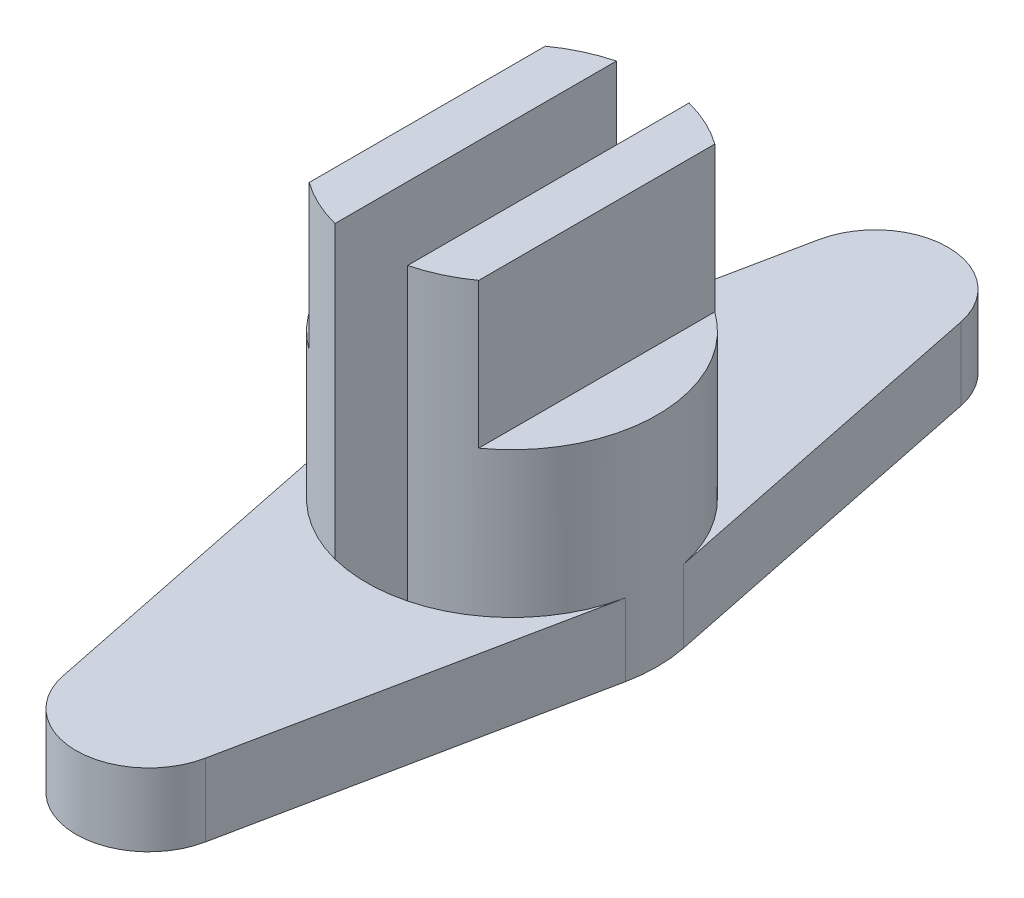
ISO-10303-21;
HEADER;
FILE_DESCRIPTION(('STEP AP214'),'2;1');
FILE_NAME('part.step','',(''),(''),'','','');
FILE_SCHEMA(('AUTOMOTIVE_DESIGN { 1 0 10303 214 1 1 1 1 }'));
ENDSEC;
DATA;
#1=APPLICATION_CONTEXT('core data for automotive mechanical design processes');
#2=APPLICATION_PROTOCOL_DEFINITION('international standard','automotive_design',2000,#1);
#3=PRODUCT_CONTEXT('',#1,'mechanical');
#4=PRODUCT('Part','Part','',(#3));
#5=PRODUCT_RELATED_PRODUCT_CATEGORY('part','',(#4));
#6=PRODUCT_DEFINITION_FORMATION('','',#4);
#7=PRODUCT_DEFINITION_CONTEXT('part definition',#1,'design');
#8=PRODUCT_DEFINITION('design','',#6,#7);
#9=PRODUCT_DEFINITION_SHAPE('','',#8);
#10=(LENGTH_UNIT() NAMED_UNIT(*) SI_UNIT(.MILLI.,.METRE.));
#11=(NAMED_UNIT(*) PLANE_ANGLE_UNIT() SI_UNIT($,.RADIAN.));
#12=(NAMED_UNIT(*) SI_UNIT($,.STERADIAN.) SOLID_ANGLE_UNIT());
#13=UNCERTAINTY_MEASURE_WITH_UNIT(LENGTH_MEASURE(1.E-05),#10,'distance_accuracy_value','');
#14=(GEOMETRIC_REPRESENTATION_CONTEXT(3) GLOBAL_UNCERTAINTY_ASSIGNED_CONTEXT((#13)) GLOBAL_UNIT_ASSIGNED_CONTEXT((#10,
#11,#12)) REPRESENTATION_CONTEXT('',''));
#15=CARTESIAN_POINT('',(0.,0.,0.));
#16=DIRECTION('',(0.,0.,1.));
#17=DIRECTION('',(1.,0.,0.));
#18=AXIS2_PLACEMENT_3D('',#15,#16,#17);
#19=CARTESIAN_POINT('',(0.,15.,0.));
#20=DIRECTION('',(0.,-1.,0.));
#21=DIRECTION('',(0.,0.,-1.));
#22=AXIS2_PLACEMENT_3D('',#19,#20,#21);
#23=CYLINDRICAL_SURFACE('',#22,30.);
#24=CARTESIAN_POINT('',(0.,75.,0.));
#25=DIRECTION('',(0.,1.,0.));
#26=DIRECTION('',(0.,0.,1.));
#27=AXIS2_PLACEMENT_3D('',#24,#25,#26);
#28=CIRCLE('',#27,30.);
#29=CARTESIAN_POINT('',(17.5,75.,-24.3669858620224));
#30=VERTEX_POINT('',#29);
#31=CARTESIAN_POINT('',(7.50000000000001,75.,-29.0473750965556));
#32=VERTEX_POINT('',#31);
#33=EDGE_CURVE('E268',#30,#32,#28,.T.);
#34=ORIENTED_EDGE('',*,*,#33,.F.);
#35=DIRECTION('',(0.,1.,0.));
#36=VECTOR('',#35,1.);
#37=CARTESIAN_POINT('',(17.5,45.,-24.3669858620224));
#38=LINE('',#37,#36);
#39=CARTESIAN_POINT('',(17.5,45.,-24.3669858620224));
#40=VERTEX_POINT('',#39);
#41=EDGE_CURVE('E64',#40,#30,#38,.T.);
#42=ORIENTED_EDGE('',*,*,#41,.F.);
#43=CARTESIAN_POINT('',(0.,45.,0.));
#44=DIRECTION('',(0.,1.,0.));
#45=DIRECTION('',(0.,0.,1.));
#46=AXIS2_PLACEMENT_3D('',#43,#44,#45);
#47=CIRCLE('',#46,30.);
#48=CARTESIAN_POINT('',(17.5,45.,24.3669858620224));
#49=VERTEX_POINT('',#48);
#50=EDGE_CURVE('E209',#49,#40,#47,.T.);
#51=ORIENTED_EDGE('',*,*,#50,.F.);
#52=DIRECTION('',(0.,1.,0.));
#53=VECTOR('',#52,1.);
#54=CARTESIAN_POINT('',(17.5,45.,24.3669858620224));
#55=LINE('',#54,#53);
#56=CARTESIAN_POINT('',(17.5,75.,24.3669858620224));
#57=VERTEX_POINT('',#56);
#58=EDGE_CURVE('E202',#49,#57,#55,.T.);
#59=ORIENTED_EDGE('',*,*,#58,.T.);
#60=CARTESIAN_POINT('',(7.50000000000001,75.,29.0473750965556));
#61=VERTEX_POINT('',#60);
#62=EDGE_CURVE('E264',#61,#57,#28,.T.);
#63=ORIENTED_EDGE('',*,*,#62,.F.);
#64=DIRECTION('',(0.,1.,0.));
#65=VECTOR('',#64,1.);
#66=CARTESIAN_POINT('',(7.50000000000001,0.,29.0473750965556));
#67=LINE('',#66,#65);
#68=CARTESIAN_POINT('',(7.50000000000001,15.,29.0473750965556));
#69=VERTEX_POINT('',#68);
#70=EDGE_CURVE('E249',#69,#61,#67,.T.);
#71=ORIENTED_EDGE('',*,*,#70,.F.);
#72=CARTESIAN_POINT('',(0.,15.,0.));
#73=DIRECTION('',(0.,1.,0.));
#74=DIRECTION('',(0.,0.,1.));
#75=AXIS2_PLACEMENT_3D('',#72,#73,#74);
#76=CIRCLE('',#75,30.);
#77=CARTESIAN_POINT('',(29.3938769133981,15.,6.));
#78=VERTEX_POINT('',#77);
#79=EDGE_CURVE('E346',#69,#78,#76,.T.);
#80=ORIENTED_EDGE('',*,*,#79,.T.);
#81=DIRECTION('',(0.,-1.,0.));
#82=VECTOR('',#81,1.);
#83=CARTESIAN_POINT('',(29.3938769133981,15.,6.));
#84=LINE('',#83,#82);
#85=CARTESIAN_POINT('',(29.3938769133981,0.,6.));
#86=VERTEX_POINT('',#85);
#87=EDGE_CURVE('E324',#78,#86,#84,.T.);
#88=ORIENTED_EDGE('',*,*,#87,.T.);
#89=CARTESIAN_POINT('',(0.,0.,0.));
#90=DIRECTION('',(0.,1.,0.));
#91=DIRECTION('',(0.,0.,1.));
#92=AXIS2_PLACEMENT_3D('',#89,#90,#91);
#93=CIRCLE('',#92,30.);
#94=CARTESIAN_POINT('',(29.3938769133981,0.,-6.));
#95=VERTEX_POINT('',#94);
#96=EDGE_CURVE('E312',#86,#95,#93,.T.);
#97=ORIENTED_EDGE('',*,*,#96,.T.);
#98=DIRECTION('',(0.,-1.,0.));
#99=VECTOR('',#98,1.);
#100=CARTESIAN_POINT('',(29.3938769133981,15.,-6.));
#101=LINE('',#100,#99);
#102=CARTESIAN_POINT('',(29.3938769133981,15.,-6.));
#103=VERTEX_POINT('',#102);
#104=EDGE_CURVE('E320',#103,#95,#101,.T.);
#105=ORIENTED_EDGE('',*,*,#104,.F.);
#106=CARTESIAN_POINT('',(7.50000000000001,15.,-29.0473750965556));
#107=VERTEX_POINT('',#106);
#108=EDGE_CURVE('E11',#103,#107,#76,.T.);
#109=ORIENTED_EDGE('',*,*,#108,.T.);
#110=DIRECTION('',(0.,1.,0.));
#111=VECTOR('',#110,1.);
#112=CARTESIAN_POINT('',(7.50000000000001,0.,-29.0473750965556));
#113=LINE('',#112,#111);
#114=EDGE_CURVE('E244',#107,#32,#113,.T.);
#115=ORIENTED_EDGE('',*,*,#114,.T.);
#116=EDGE_LOOP('',(#34,#42,#51,#59,#63,#71,#80,#88,#97,#105,#109,#115));
#117=FACE_BOUND('',#116,.T.);
#118=ADVANCED_FACE('F45',(#117),#23,.T.);
#119=CARTESIAN_POINT('',(0.,75.,0.));
#120=DIRECTION('',(0.,1.,0.));
#121=DIRECTION('',(0.,0.,1.));
#122=AXIS2_PLACEMENT_3D('',#119,#120,#121);
#123=PLANE('',#122);
#124=DIRECTION('',(0.,0.,1.));
#125=VECTOR('',#124,1.);
#126=CARTESIAN_POINT('',(17.5,75.,24.3669858620224));
#127=LINE('',#126,#125);
#128=EDGE_CURVE('E206',#30,#57,#127,.T.);
#129=ORIENTED_EDGE('',*,*,#128,.F.);
#130=ORIENTED_EDGE('',*,*,#33,.T.);
#131=DIRECTION('',(0.,0.,-1.));
#132=VECTOR('',#131,1.);
#133=CARTESIAN_POINT('',(7.50000000000001,75.,-29.0473750965556));
#134=LINE('',#133,#132);
#135=EDGE_CURVE('E220',#61,#32,#134,.T.);
#136=ORIENTED_EDGE('',*,*,#135,.F.);
#137=ORIENTED_EDGE('',*,*,#62,.T.);
#138=EDGE_LOOP('',(#129,#130,#136,#137));
#139=FACE_BOUND('',#138,.T.);
#140=ADVANCED_FACE('F403',(#139),#123,.T.);
#141=CARTESIAN_POINT('',(0.,15.,-75.));
#142=DIRECTION('',(0.,1.,0.));
#143=DIRECTION('',(0.,0.,1.));
#144=AXIS2_PLACEMENT_3D('',#141,#142,#143);
#145=PLANE('',#144);
#146=ORIENTED_EDGE('',*,*,#108,.F.);
#147=DIRECTION('',(-0.2,0.,-0.979795897113271));
#148=VECTOR('',#147,1.);
#149=CARTESIAN_POINT('',(14.6969384566991,15.,-78.));
#150=LINE('',#149,#148);
#151=CARTESIAN_POINT('',(14.6969384566991,15.,-78.));
#152=VERTEX_POINT('',#151);
#153=EDGE_CURVE('E290',#103,#152,#150,.T.);
#154=ORIENTED_EDGE('',*,*,#153,.T.);
#155=CARTESIAN_POINT('',(0.,15.,-75.));
#156=DIRECTION('',(0.,1.,0.));
#157=DIRECTION('',(0.,0.,1.));
#158=AXIS2_PLACEMENT_3D('',#155,#156,#157);
#159=CIRCLE('',#158,15.);
#160=CARTESIAN_POINT('',(-14.6969384566991,15.,-78.));
#161=VERTEX_POINT('',#160);
#162=EDGE_CURVE('E271',#152,#161,#159,.T.);
#163=ORIENTED_EDGE('',*,*,#162,.T.);
#164=DIRECTION('',(-0.2,0.,0.979795897113271));
#165=VECTOR('',#164,1.);
#166=CARTESIAN_POINT('',(-14.6969384566991,15.,-78.));
#167=LINE('',#166,#165);
#168=CARTESIAN_POINT('',(-29.3938769133981,15.,-6.));
#169=VERTEX_POINT('',#168);
#170=EDGE_CURVE('E275',#161,#169,#167,.T.);
#171=ORIENTED_EDGE('',*,*,#170,.T.);
#172=CARTESIAN_POINT('',(-7.50000000000001,15.,-29.0473750965556));
#173=VERTEX_POINT('',#172);
#174=EDGE_CURVE('E55',#173,#169,#76,.T.);
#175=ORIENTED_EDGE('',*,*,#174,.F.);
#176=CARTESIAN_POINT('',(0.,15.,0.));
#177=DIRECTION('',(0.,1.,0.));
#178=DIRECTION('',(0.,0.,1.));
#179=AXIS2_PLACEMENT_3D('',#176,#177,#178);
#180=CIRCLE('',#179,30.);
#181=EDGE_CURVE('E261',#107,#173,#180,.T.);
#182=ORIENTED_EDGE('',*,*,#181,.F.);
#183=EDGE_LOOP('',(#146,#154,#163,#171,#175,#182));
#184=FACE_BOUND('',#183,.T.);
#185=ADVANCED_FACE('F362',(#184),#145,.T.);
#186=CARTESIAN_POINT('',(0.,15.,-75.));
#187=DIRECTION('',(0.,-1.,0.));
#188=DIRECTION('',(0.,0.,-1.));
#189=AXIS2_PLACEMENT_3D('',#186,#187,#188);
#190=CYLINDRICAL_SURFACE('',#189,15.);
#191=CARTESIAN_POINT('',(0.,0.,-75.));
#192=DIRECTION('',(0.,1.,0.));
#193=DIRECTION('',(0.,0.,1.));
#194=AXIS2_PLACEMENT_3D('',#191,#192,#193);
#195=CIRCLE('',#194,15.);
#196=CARTESIAN_POINT('',(14.6969384566991,0.,-78.));
#197=VERTEX_POINT('',#196);
#198=CARTESIAN_POINT('',(-14.6969384566991,0.,-78.));
#199=VERTEX_POINT('',#198);
#200=EDGE_CURVE('E267',#197,#199,#195,.T.);
#201=ORIENTED_EDGE('',*,*,#200,.T.);
#202=DIRECTION('',(0.,-1.,0.));
#203=VECTOR('',#202,1.);
#204=CARTESIAN_POINT('',(-14.6969384566991,15.,-78.));
#205=LINE('',#204,#203);
#206=EDGE_CURVE('E49',#161,#199,#205,.T.);
#207=ORIENTED_EDGE('',*,*,#206,.F.);
#208=ORIENTED_EDGE('',*,*,#162,.F.);
#209=DIRECTION('',(0.,-1.,0.));
#210=VECTOR('',#209,1.);
#211=CARTESIAN_POINT('',(14.6969384566991,15.,-78.));
#212=LINE('',#211,#210);
#213=EDGE_CURVE('E293',#152,#197,#212,.T.);
#214=ORIENTED_EDGE('',*,*,#213,.T.);
#215=EDGE_LOOP('',(#201,#207,#208,#214));
#216=FACE_BOUND('',#215,.T.);
#217=ADVANCED_FACE('F47',(#216),#190,.T.);
#218=CARTESIAN_POINT('',(-14.6969384566991,15.,-78.));
#219=DIRECTION('',(0.979795897113271,0.,0.2));
#220=DIRECTION('',(0.2,0.,-0.979795897113271));
#221=AXIS2_PLACEMENT_3D('',#218,#219,#220);
#222=PLANE('',#221);
#223=DIRECTION('',(-0.2,0.,0.979795897113271));
#224=VECTOR('',#223,1.);
#225=CARTESIAN_POINT('',(-14.6969384566991,0.,-78.));
#226=LINE('',#225,#224);
#227=CARTESIAN_POINT('',(-29.3938769133981,0.,-6.));
#228=VERTEX_POINT('',#227);
#229=EDGE_CURVE('E297',#199,#228,#226,.T.);
#230=ORIENTED_EDGE('',*,*,#229,.T.);
#231=DIRECTION('',(0.,-1.,0.));
#232=VECTOR('',#231,1.);
#233=CARTESIAN_POINT('',(-29.3938769133981,15.,-6.));
#234=LINE('',#233,#232);
#235=EDGE_CURVE('E339',#169,#228,#234,.T.);
#236=ORIENTED_EDGE('',*,*,#235,.F.);
#237=ORIENTED_EDGE('',*,*,#170,.F.);
#238=ORIENTED_EDGE('',*,*,#206,.T.);
#239=EDGE_LOOP('',(#230,#236,#237,#238));
#240=FACE_BOUND('',#239,.T.);
#241=ADVANCED_FACE('F364',(#240),#222,.F.);
#242=CARTESIAN_POINT('',(-14.6969384566991,15.,78.));
#243=DIRECTION('',(0.979795897113271,0.,-0.2));
#244=DIRECTION('',(-0.2,0.,-0.979795897113271));
#245=AXIS2_PLACEMENT_3D('',#242,#243,#244);
#246=PLANE('',#245);
#247=DIRECTION('',(0.2,0.,0.979795897113271));
#248=VECTOR('',#247,1.);
#249=CARTESIAN_POINT('',(-14.6969384566991,0.,78.));
#250=LINE('',#249,#248);
#251=CARTESIAN_POINT('',(-29.3938769133981,0.,6.));
#252=VERTEX_POINT('',#251);
#253=CARTESIAN_POINT('',(-14.6969384566991,0.,78.));
#254=VERTEX_POINT('',#253);
#255=EDGE_CURVE('E303',#252,#254,#250,.T.);
#256=ORIENTED_EDGE('',*,*,#255,.T.);
#257=DIRECTION('',(0.,-1.,0.));
#258=VECTOR('',#257,1.);
#259=CARTESIAN_POINT('',(-14.6969384566991,15.,78.));
#260=LINE('',#259,#258);
#261=CARTESIAN_POINT('',(-14.6969384566991,15.,78.));
#262=VERTEX_POINT('',#261);
#263=EDGE_CURVE('E332',#262,#254,#260,.T.);
#264=ORIENTED_EDGE('',*,*,#263,.F.);
#265=DIRECTION('',(0.2,0.,0.979795897113271));
#266=VECTOR('',#265,1.);
#267=CARTESIAN_POINT('',(-14.6969384566991,15.,78.));
#268=LINE('',#267,#266);
#269=CARTESIAN_POINT('',(-29.3938769133981,15.,6.));
#270=VERTEX_POINT('',#269);
#271=EDGE_CURVE('E280',#270,#262,#268,.T.);
#272=ORIENTED_EDGE('',*,*,#271,.F.);
#273=DIRECTION('',(0.,-1.,0.));
#274=VECTOR('',#273,1.);
#275=CARTESIAN_POINT('',(-29.3938769133981,15.,6.));
#276=LINE('',#275,#274);
#277=EDGE_CURVE('E336',#270,#252,#276,.T.);
#278=ORIENTED_EDGE('',*,*,#277,.T.);
#279=EDGE_LOOP('',(#256,#264,#272,#278));
#280=FACE_BOUND('',#279,.T.);
#281=ADVANCED_FACE('F374',(#280),#246,.F.);
#282=CARTESIAN_POINT('',(0.,15.,75.));
#283=DIRECTION('',(0.,-1.,0.));
#284=DIRECTION('',(0.,0.,-1.));
#285=AXIS2_PLACEMENT_3D('',#282,#283,#284);
#286=CYLINDRICAL_SURFACE('',#285,15.);
#287=CARTESIAN_POINT('',(0.,0.,75.));
#288=DIRECTION('',(0.,1.,0.));
#289=DIRECTION('',(0.,0.,1.));
#290=AXIS2_PLACEMENT_3D('',#287,#288,#289);
#291=CIRCLE('',#290,15.);
#292=CARTESIAN_POINT('',(14.6969384566991,0.,78.));
#293=VERTEX_POINT('',#292);
#294=EDGE_CURVE('E306',#254,#293,#291,.T.);
#295=ORIENTED_EDGE('',*,*,#294,.T.);
#296=DIRECTION('',(0.,-1.,0.));
#297=VECTOR('',#296,1.);
#298=CARTESIAN_POINT('',(14.6969384566991,15.,78.));
#299=LINE('',#298,#297);
#300=CARTESIAN_POINT('',(14.6969384566991,15.,78.));
#301=VERTEX_POINT('',#300);
#302=EDGE_CURVE('E328',#301,#293,#299,.T.);
#303=ORIENTED_EDGE('',*,*,#302,.F.);
#304=CARTESIAN_POINT('',(0.,15.,75.));
#305=DIRECTION('',(0.,1.,0.));
#306=DIRECTION('',(0.,0.,1.));
#307=AXIS2_PLACEMENT_3D('',#304,#305,#306);
#308=CIRCLE('',#307,15.);
#309=EDGE_CURVE('E283',#262,#301,#308,.T.);
#310=ORIENTED_EDGE('',*,*,#309,.F.);
#311=ORIENTED_EDGE('',*,*,#263,.T.);
#312=EDGE_LOOP('',(#295,#303,#310,#311));
#313=FACE_BOUND('',#312,.T.);
#314=ADVANCED_FACE('F434',(#313),#286,.T.);
#315=CARTESIAN_POINT('',(14.6969384566991,15.,78.));
#316=DIRECTION('',(-0.979795897113271,0.,-0.2));
#317=DIRECTION('',(-0.2,0.,0.979795897113271));
#318=AXIS2_PLACEMENT_3D('',#315,#316,#317);
#319=PLANE('',#318);
#320=DIRECTION('',(0.2,0.,-0.979795897113271));
#321=VECTOR('',#320,1.);
#322=CARTESIAN_POINT('',(14.6969384566991,0.,78.));
#323=LINE('',#322,#321);
#324=EDGE_CURVE('E309',#293,#86,#323,.T.);
#325=ORIENTED_EDGE('',*,*,#324,.T.);
#326=ORIENTED_EDGE('',*,*,#87,.F.);
#327=DIRECTION('',(0.2,0.,-0.979795897113271));
#328=VECTOR('',#327,1.);
#329=CARTESIAN_POINT('',(14.6969384566991,15.,78.));
#330=LINE('',#329,#328);
#331=EDGE_CURVE('E286',#301,#78,#330,.T.);
#332=ORIENTED_EDGE('',*,*,#331,.F.);
#333=ORIENTED_EDGE('',*,*,#302,.T.);
#334=EDGE_LOOP('',(#325,#326,#332,#333));
#335=FACE_BOUND('',#334,.T.);
#336=ADVANCED_FACE('F427',(#335),#319,.F.);
#337=CARTESIAN_POINT('',(-17.5,75.,24.3669858620224));
#338=VERTEX_POINT('',#337);
#339=CARTESIAN_POINT('',(-7.50000000000001,75.,29.0473750965556));
#340=VERTEX_POINT('',#339);
#341=EDGE_CURVE('E191',#338,#340,#28,.T.);
#342=ORIENTED_EDGE('',*,*,#341,.F.);
#343=DIRECTION('',(0.,1.,0.));
#344=VECTOR('',#343,1.);
#345=CARTESIAN_POINT('',(-17.5,45.,24.3669858620224));
#346=LINE('',#345,#344);
#347=CARTESIAN_POINT('',(-17.5,45.,24.3669858620224));
#348=VERTEX_POINT('',#347);
#349=EDGE_CURVE('E72',#348,#338,#346,.T.);
#350=ORIENTED_EDGE('',*,*,#349,.F.);
#351=CARTESIAN_POINT('',(0.,45.,0.));
#352=DIRECTION('',(0.,1.,0.));
#353=DIRECTION('',(0.,0.,1.));
#354=AXIS2_PLACEMENT_3D('',#351,#352,#353);
#355=CIRCLE('',#354,30.);
#356=CARTESIAN_POINT('',(-17.5,45.,-24.3669858620224));
#357=VERTEX_POINT('',#356);
#358=EDGE_CURVE('E176',#357,#348,#355,.T.);
#359=ORIENTED_EDGE('',*,*,#358,.F.);
#360=DIRECTION('',(0.,1.,0.));
#361=VECTOR('',#360,1.);
#362=CARTESIAN_POINT('',(-17.5,45.,-24.3669858620224));
#363=LINE('',#362,#361);
#364=CARTESIAN_POINT('',(-17.5,75.,-24.3669858620224));
#365=VERTEX_POINT('',#364);
#366=EDGE_CURVE('E185',#357,#365,#363,.T.);
#367=ORIENTED_EDGE('',*,*,#366,.T.);
#368=CARTESIAN_POINT('',(-7.50000000000001,75.,-29.0473750965556));
#369=VERTEX_POINT('',#368);
#370=EDGE_CURVE('E269',#369,#365,#28,.T.);
#371=ORIENTED_EDGE('',*,*,#370,.F.);
#372=DIRECTION('',(0.,1.,0.));
#373=VECTOR('',#372,1.);
#374=CARTESIAN_POINT('',(-7.50000000000001,0.,-29.0473750965556));
#375=LINE('',#374,#373);
#376=EDGE_CURVE('E232',#173,#369,#375,.T.);
#377=ORIENTED_EDGE('',*,*,#376,.F.);
#378=ORIENTED_EDGE('',*,*,#174,.T.);
#379=ORIENTED_EDGE('',*,*,#235,.T.);
#380=CARTESIAN_POINT('',(0.,0.,0.));
#381=DIRECTION('',(0.,1.,0.));
#382=DIRECTION('',(0.,0.,1.));
#383=AXIS2_PLACEMENT_3D('',#380,#381,#382);
#384=CIRCLE('',#383,30.);
#385=EDGE_CURVE('E300',#228,#252,#384,.T.);
#386=ORIENTED_EDGE('',*,*,#385,.T.);
#387=ORIENTED_EDGE('',*,*,#277,.F.);
#388=CARTESIAN_POINT('',(-7.50000000000001,15.,29.0473750965556));
#389=VERTEX_POINT('',#388);
#390=EDGE_CURVE('E57',#270,#389,#76,.T.);
#391=ORIENTED_EDGE('',*,*,#390,.T.);
#392=DIRECTION('',(0.,1.,0.));
#393=VECTOR('',#392,1.);
#394=CARTESIAN_POINT('',(-7.50000000000001,0.,29.0473750965556));
#395=LINE('',#394,#393);
#396=EDGE_CURVE('E254',#389,#340,#395,.T.);
#397=ORIENTED_EDGE('',*,*,#396,.T.);
#398=EDGE_LOOP('',(#342,#350,#359,#367,#371,#377,#378,#379,#386,#387,#391,#397));
#399=FACE_BOUND('',#398,.T.);
#400=ADVANCED_FACE('F189',(#399),#23,.T.);
#401=CARTESIAN_POINT('',(14.6969384566991,15.,-78.));
#402=DIRECTION('',(-0.979795897113271,0.,0.2));
#403=DIRECTION('',(0.2,0.,0.979795897113271));
#404=AXIS2_PLACEMENT_3D('',#401,#402,#403);
#405=PLANE('',#404);
#406=DIRECTION('',(-0.2,0.,-0.979795897113271));
#407=VECTOR('',#406,1.);
#408=CARTESIAN_POINT('',(14.6969384566991,0.,-78.));
#409=LINE('',#408,#407);
#410=EDGE_CURVE('E276',#95,#197,#409,.T.);
#411=ORIENTED_EDGE('',*,*,#410,.T.);
#412=ORIENTED_EDGE('',*,*,#213,.F.);
#413=ORIENTED_EDGE('',*,*,#153,.F.);
#414=ORIENTED_EDGE('',*,*,#104,.T.);
#415=EDGE_LOOP('',(#411,#412,#413,#414));
#416=FACE_BOUND('',#415,.T.);
#417=ADVANCED_FACE('F426',(#416),#405,.F.);
#418=ORIENTED_EDGE('',*,*,#390,.F.);
#419=ORIENTED_EDGE('',*,*,#271,.T.);
#420=ORIENTED_EDGE('',*,*,#309,.T.);
#421=ORIENTED_EDGE('',*,*,#331,.T.);
#422=ORIENTED_EDGE('',*,*,#79,.F.);
#423=CARTESIAN_POINT('',(0.,15.,0.));
#424=DIRECTION('',(0.,1.,0.));
#425=DIRECTION('',(0.,0.,1.));
#426=AXIS2_PLACEMENT_3D('',#423,#424,#425);
#427=CIRCLE('',#426,30.);
#428=EDGE_CURVE('E243',#389,#69,#427,.T.);
#429=ORIENTED_EDGE('',*,*,#428,.F.);
#430=EDGE_LOOP('',(#418,#419,#420,#421,#422,#429));
#431=FACE_BOUND('',#430,.T.);
#432=ADVANCED_FACE('F378',(#431),#145,.T.);
#433=CARTESIAN_POINT('',(0.,0.,-75.));
#434=DIRECTION('',(0.,1.,0.));
#435=DIRECTION('',(0.,0.,1.));
#436=AXIS2_PLACEMENT_3D('',#433,#434,#435);
#437=PLANE('',#436);
#438=DIRECTION('',(0.,0.,-1.));
#439=VECTOR('',#438,1.);
#440=CARTESIAN_POINT('',(7.50000000000001,0.,-29.0473750965556));
#441=LINE('',#440,#439);
#442=CARTESIAN_POINT('',(7.50000000000001,0.,29.0473750965556));
#443=VERTEX_POINT('',#442);
#444=CARTESIAN_POINT('',(7.50000000000001,0.,-29.0473750965556));
#445=VERTEX_POINT('',#444);
#446=EDGE_CURVE('E228',#443,#445,#441,.T.);
#447=ORIENTED_EDGE('',*,*,#446,.T.);
#448=CARTESIAN_POINT('',(0.,0.,0.));
#449=DIRECTION('',(0.,1.,0.));
#450=DIRECTION('',(0.,0.,1.));
#451=AXIS2_PLACEMENT_3D('',#448,#449,#450);
#452=CIRCLE('',#451,30.);
#453=CARTESIAN_POINT('',(-7.50000000000001,0.,-29.0473750965556));
#454=VERTEX_POINT('',#453);
#455=EDGE_CURVE('E215',#445,#454,#452,.T.);
#456=ORIENTED_EDGE('',*,*,#455,.T.);
#457=DIRECTION('',(0.,0.,1.));
#458=VECTOR('',#457,1.);
#459=CARTESIAN_POINT('',(-7.50000000000001,0.,-29.0473750965556));
#460=LINE('',#459,#458);
#461=CARTESIAN_POINT('',(-7.50000000000001,0.,29.0473750965556));
#462=VERTEX_POINT('',#461);
#463=EDGE_CURVE('E219',#454,#462,#460,.T.);
#464=ORIENTED_EDGE('',*,*,#463,.T.);
#465=CARTESIAN_POINT('',(0.,0.,0.));
#466=DIRECTION('',(0.,1.,0.));
#467=DIRECTION('',(0.,0.,1.));
#468=AXIS2_PLACEMENT_3D('',#465,#466,#467);
#469=CIRCLE('',#468,30.);
#470=EDGE_CURVE('E224',#462,#443,#469,.T.);
#471=ORIENTED_EDGE('',*,*,#470,.T.);
#472=EDGE_LOOP('',(#447,#456,#464,#471));
#473=FACE_BOUND('',#472,.T.);
#474=ORIENTED_EDGE('',*,*,#200,.F.);
#475=ORIENTED_EDGE('',*,*,#410,.F.);
#476=ORIENTED_EDGE('',*,*,#96,.F.);
#477=ORIENTED_EDGE('',*,*,#324,.F.);
#478=ORIENTED_EDGE('',*,*,#294,.F.);
#479=ORIENTED_EDGE('',*,*,#255,.F.);
#480=ORIENTED_EDGE('',*,*,#385,.F.);
#481=ORIENTED_EDGE('',*,*,#229,.F.);
#482=EDGE_LOOP('',(#474,#475,#476,#477,#478,#479,#480,#481));
#483=FACE_BOUND('',#482,.T.);
#484=ADVANCED_FACE('F367',(#473,#483),#437,.F.);
#485=DIRECTION('',(0.,0.,-1.));
#486=VECTOR('',#485,1.);
#487=CARTESIAN_POINT('',(-17.5,75.,-24.3669858620224));
#488=LINE('',#487,#486);
#489=EDGE_CURVE('E182',#338,#365,#488,.T.);
#490=ORIENTED_EDGE('',*,*,#489,.F.);
#491=ORIENTED_EDGE('',*,*,#341,.T.);
#492=DIRECTION('',(0.,0.,1.));
#493=VECTOR('',#492,1.);
#494=CARTESIAN_POINT('',(-7.50000000000001,75.,-29.0473750965556));
#495=LINE('',#494,#493);
#496=EDGE_CURVE('E195',#369,#340,#495,.T.);
#497=ORIENTED_EDGE('',*,*,#496,.F.);
#498=ORIENTED_EDGE('',*,*,#370,.T.);
#499=EDGE_LOOP('',(#490,#491,#497,#498));
#500=FACE_BOUND('',#499,.T.);
#501=ADVANCED_FACE('F391',(#500),#123,.T.);
#502=CARTESIAN_POINT('',(0.,0.,0.));
#503=DIRECTION('',(0.,1.,0.));
#504=DIRECTION('',(0.,0.,1.));
#505=AXIS2_PLACEMENT_3D('',#502,#503,#504);
#506=CYLINDRICAL_SURFACE('',#505,30.);
#507=ORIENTED_EDGE('',*,*,#181,.T.);
#508=EDGE_CURVE('E255',#454,#173,#375,.T.);
#509=ORIENTED_EDGE('',*,*,#508,.F.);
#510=ORIENTED_EDGE('',*,*,#455,.F.);
#511=EDGE_CURVE('E239',#445,#107,#113,.T.);
#512=ORIENTED_EDGE('',*,*,#511,.T.);
#513=EDGE_LOOP('',(#507,#509,#510,#512));
#514=FACE_BOUND('',#513,.T.);
#515=ADVANCED_FACE('F459',(#514),#506,.F.);
#516=CARTESIAN_POINT('',(7.50000000000001,0.,-29.0473750965556));
#517=DIRECTION('',(1.,0.,0.));
#518=DIRECTION('',(0.,0.,-1.));
#519=AXIS2_PLACEMENT_3D('',#516,#517,#518);
#520=PLANE('',#519);
#521=ORIENTED_EDGE('',*,*,#135,.T.);
#522=ORIENTED_EDGE('',*,*,#114,.F.);
#523=ORIENTED_EDGE('',*,*,#511,.F.);
#524=ORIENTED_EDGE('',*,*,#446,.F.);
#525=EDGE_CURVE('E245',#443,#69,#67,.T.);
#526=ORIENTED_EDGE('',*,*,#525,.T.);
#527=ORIENTED_EDGE('',*,*,#70,.T.);
#528=EDGE_LOOP('',(#521,#522,#523,#524,#526,#527));
#529=FACE_BOUND('',#528,.T.);
#530=ADVANCED_FACE('F399',(#529),#520,.F.);
#531=CARTESIAN_POINT('',(0.,0.,0.));
#532=DIRECTION('',(0.,1.,0.));
#533=DIRECTION('',(0.,0.,1.));
#534=AXIS2_PLACEMENT_3D('',#531,#532,#533);
#535=CYLINDRICAL_SURFACE('',#534,30.);
#536=ORIENTED_EDGE('',*,*,#428,.T.);
#537=ORIENTED_EDGE('',*,*,#525,.F.);
#538=ORIENTED_EDGE('',*,*,#470,.F.);
#539=EDGE_CURVE('E250',#462,#389,#395,.T.);
#540=ORIENTED_EDGE('',*,*,#539,.T.);
#541=EDGE_LOOP('',(#536,#537,#538,#540));
#542=FACE_BOUND('',#541,.T.);
#543=ADVANCED_FACE('F463',(#542),#535,.F.);
#544=CARTESIAN_POINT('',(-7.50000000000001,0.,-29.0473750965556));
#545=DIRECTION('',(-1.,0.,0.));
#546=DIRECTION('',(0.,0.,1.));
#547=AXIS2_PLACEMENT_3D('',#544,#545,#546);
#548=PLANE('',#547);
#549=ORIENTED_EDGE('',*,*,#496,.T.);
#550=ORIENTED_EDGE('',*,*,#396,.F.);
#551=ORIENTED_EDGE('',*,*,#539,.F.);
#552=ORIENTED_EDGE('',*,*,#463,.F.);
#553=ORIENTED_EDGE('',*,*,#508,.T.);
#554=ORIENTED_EDGE('',*,*,#376,.T.);
#555=EDGE_LOOP('',(#549,#550,#551,#552,#553,#554));
#556=FACE_BOUND('',#555,.T.);
#557=ADVANCED_FACE('F387',(#556),#548,.F.);
#558=CARTESIAN_POINT('',(-17.5,45.,-24.3669858620224));
#559=DIRECTION('',(1.,0.,0.));
#560=DIRECTION('',(0.,0.,-1.));
#561=AXIS2_PLACEMENT_3D('',#558,#559,#560);
#562=PLANE('',#561);
#563=ORIENTED_EDGE('',*,*,#489,.T.);
#564=ORIENTED_EDGE('',*,*,#366,.F.);
#565=DIRECTION('',(0.,0.,-1.));
#566=VECTOR('',#565,1.);
#567=CARTESIAN_POINT('',(-17.5,45.,-24.3669858620224));
#568=LINE('',#567,#566);
#569=EDGE_CURVE('E178',#348,#357,#568,.T.);
#570=ORIENTED_EDGE('',*,*,#569,.F.);
#571=ORIENTED_EDGE('',*,*,#349,.T.);
#572=EDGE_LOOP('',(#563,#564,#570,#571));
#573=FACE_BOUND('',#572,.T.);
#574=ADVANCED_FACE('F184',(#573),#562,.F.);
#575=CARTESIAN_POINT('',(0.,45.,0.));
#576=DIRECTION('',(0.,1.,0.));
#577=DIRECTION('',(0.,0.,1.));
#578=AXIS2_PLACEMENT_3D('',#575,#576,#577);
#579=PLANE('',#578);
#580=ORIENTED_EDGE('',*,*,#358,.T.);
#581=ORIENTED_EDGE('',*,*,#569,.T.);
#582=EDGE_LOOP('',(#580,#581));
#583=FACE_BOUND('',#582,.T.);
#584=ADVANCED_FACE('F177',(#583),#579,.T.);
#585=CARTESIAN_POINT('',(17.5,45.,24.3669858620224));
#586=DIRECTION('',(-1.,0.,0.));
#587=DIRECTION('',(0.,0.,1.));
#588=AXIS2_PLACEMENT_3D('',#585,#586,#587);
#589=PLANE('',#588);
#590=ORIENTED_EDGE('',*,*,#128,.T.);
#591=ORIENTED_EDGE('',*,*,#58,.F.);
#592=DIRECTION('',(0.,0.,1.));
#593=VECTOR('',#592,1.);
#594=CARTESIAN_POINT('',(17.5,45.,24.3669858620224));
#595=LINE('',#594,#593);
#596=EDGE_CURVE('E201',#40,#49,#595,.T.);
#597=ORIENTED_EDGE('',*,*,#596,.F.);
#598=ORIENTED_EDGE('',*,*,#41,.T.);
#599=EDGE_LOOP('',(#590,#591,#597,#598));
#600=FACE_BOUND('',#599,.T.);
#601=ADVANCED_FACE('F406',(#600),#589,.F.);
#602=CARTESIAN_POINT('',(0.,45.,0.));
#603=DIRECTION('',(0.,1.,0.));
#604=DIRECTION('',(0.,0.,1.));
#605=AXIS2_PLACEMENT_3D('',#602,#603,#604);
#606=PLANE('',#605);
#607=ORIENTED_EDGE('',*,*,#50,.T.);
#608=ORIENTED_EDGE('',*,*,#596,.T.);
#609=EDGE_LOOP('',(#607,#608));
#610=FACE_BOUND('',#609,.T.);
#611=ADVANCED_FACE('F408',(#610),#606,.T.);
#612=CLOSED_SHELL('',(#118,#140,#185,#217,#241,#281,#314,#336,#400,#417,#432,#484,#501,#515,
#530,#543,#557,#574,#584,#601,#611));
#613=MANIFOLD_SOLID_BREP('B2',#612);
#614=ADVANCED_BREP_SHAPE_REPRESENTATION('',(#18,#613),#14);
#615=SHAPE_DEFINITION_REPRESENTATION(#9,#614);
ENDSEC;
END-ISO-10303-21;
